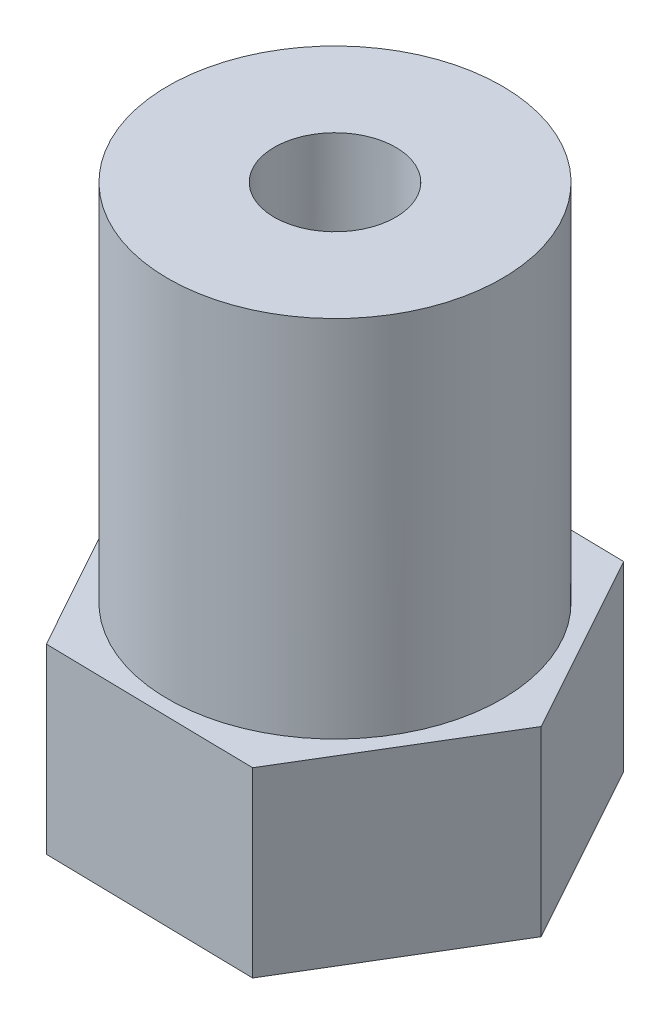
ISO-10303-21;
HEADER;
FILE_DESCRIPTION(('STEP AP214'),'2;1');
FILE_NAME('part.step','',(''),(''),'','','');
FILE_SCHEMA(('AUTOMOTIVE_DESIGN { 1 0 10303 214 1 1 1 1 }'));
ENDSEC;
DATA;
#1=APPLICATION_CONTEXT('core data for automotive mechanical design processes');
#2=APPLICATION_PROTOCOL_DEFINITION('international standard','automotive_design',2000,#1);
#3=PRODUCT_CONTEXT('',#1,'mechanical');
#4=PRODUCT('Part','Part','',(#3));
#5=PRODUCT_RELATED_PRODUCT_CATEGORY('part','',(#4));
#6=PRODUCT_DEFINITION_FORMATION('','',#4);
#7=PRODUCT_DEFINITION_CONTEXT('part definition',#1,'design');
#8=PRODUCT_DEFINITION('design','',#6,#7);
#9=PRODUCT_DEFINITION_SHAPE('','',#8);
#10=(LENGTH_UNIT() NAMED_UNIT(*) SI_UNIT(.MILLI.,.METRE.));
#11=(NAMED_UNIT(*) PLANE_ANGLE_UNIT() SI_UNIT($,.RADIAN.));
#12=(NAMED_UNIT(*) SI_UNIT($,.STERADIAN.) SOLID_ANGLE_UNIT());
#13=UNCERTAINTY_MEASURE_WITH_UNIT(LENGTH_MEASURE(1.E-05),#10,'distance_accuracy_value','');
#14=(GEOMETRIC_REPRESENTATION_CONTEXT(3) GLOBAL_UNCERTAINTY_ASSIGNED_CONTEXT((#13)) GLOBAL_UNIT_ASSIGNED_CONTEXT((#10,
#11,#12)) REPRESENTATION_CONTEXT('',''));
#15=CARTESIAN_POINT('',(0.,0.,0.));
#16=DIRECTION('',(0.,0.,1.));
#17=DIRECTION('',(1.,0.,0.));
#18=AXIS2_PLACEMENT_3D('',#15,#16,#17);
#19=CARTESIAN_POINT('',(0.,12.,0.));
#20=DIRECTION('',(0.,-1.,0.));
#21=DIRECTION('',(0.,0.,-1.));
#22=AXIS2_PLACEMENT_3D('',#19,#20,#21);
#23=CYLINDRICAL_SURFACE('',#22,5.5);
#24=CARTESIAN_POINT('',(0.,7.99724347918509,-5.5));
#25=CARTESIAN_POINT('',(-0.109190966844575,7.99150798310246,-5.50000160584769));
#26=CARTESIAN_POINT('',(-0.217893355600704,7.97679236645259,-5.49671935829978));
#27=CARTESIAN_POINT('',(-0.431116680932088,7.93000165054152,-5.48411785814425));
#28=CARTESIAN_POINT('',(-0.535637488522262,7.89792601623579,-5.4747984194656));
#29=CARTESIAN_POINT('',(-0.737419688843674,7.81766204607608,-5.45128621373905));
#30=CARTESIAN_POINT('',(-0.834695713776041,7.76950732727135,-5.43710361260609));
#31=CARTESIAN_POINT('',(-1.01989505112939,7.65854080306178,-5.40542806137451));
#32=CARTESIAN_POINT('',(-1.10781610424806,7.59572546864283,-5.38793431442899));
#33=CARTESIAN_POINT('',(-1.2755211298687,7.45436112730188,-5.35076741174238));
#34=CARTESIAN_POINT('',(-1.35485833984816,7.3752971749169,-5.33103610320501));
#35=CARTESIAN_POINT('',(-1.49939864460353,7.20499402000117,-5.29220337788619));
#36=CARTESIAN_POINT('',(-1.56459869713977,7.11375220367128,-5.27310209743171));
#37=CARTESIAN_POINT('',(-1.68045668943114,6.9188753167856,-5.2373507129052));
#38=CARTESIAN_POINT('',(-1.73072254035142,6.81499287070177,-5.22077149265896));
#39=CARTESIAN_POINT('',(-1.81272742841725,6.59950021464378,-5.19287159417589));
#40=CARTESIAN_POINT('',(-1.84447536354218,6.48789374500076,-5.18154839092357));
#41=CARTESIAN_POINT('',(-1.88702886561226,6.26601680336966,-5.16619904657778));
#42=CARTESIAN_POINT('',(-1.89879324841239,6.15595364088142,-5.16183945980972));
#43=CARTESIAN_POINT('',(-1.90386241787796,5.9353597266681,-5.15997287528903));
#44=CARTESIAN_POINT('',(-1.89717217694077,5.82482910890629,-5.16246403167772));
#45=CARTESIAN_POINT('',(-1.86639309290652,5.61191505368766,-5.17366573611602));
#46=CARTESIAN_POINT('',(-1.84313873068264,5.50939310700469,-5.18207776533949));
#47=CARTESIAN_POINT('',(-1.7810262979067,5.30973990956169,-5.20375045675684));
#48=CARTESIAN_POINT('',(-1.74216534168879,5.21260965951114,-5.21701201559021));
#49=CARTESIAN_POINT('',(-1.64859354096766,5.02303702618544,-5.24734443348433));
#50=CARTESIAN_POINT('',(-1.59341805886909,4.93084186508697,-5.26452299747749));
#51=CARTESIAN_POINT('',(-1.46926374742691,4.75661248194948,-5.30051274069235));
#52=CARTESIAN_POINT('',(-1.40028015602499,4.67458178121435,-5.31932448188351));
#53=CARTESIAN_POINT('',(-1.24556571380045,4.51784786357802,-5.35773129547569));
#54=CARTESIAN_POINT('',(-1.15907434432745,4.44388781531108,-5.3773049380856));
#55=CARTESIAN_POINT('',(-0.974493649003457,4.31135199235108,-5.41379730484188));
#56=CARTESIAN_POINT('',(-0.876403994929309,4.25277665318547,-5.43071595382229));
#57=CARTESIAN_POINT('',(-0.671135661757936,4.15283928932914,-5.45988187231249));
#58=CARTESIAN_POINT('',(-0.563956857273626,4.11147750215014,-5.47212907736574));
#59=CARTESIAN_POINT('',(-0.34363533237762,4.04754671085956,-5.49036500207096));
#60=CARTESIAN_POINT('',(-0.230495248568585,4.02496947153632,-5.4963564645564));
#61=CARTESIAN_POINT('',(-0.00810853423754321,4.00024346278213,-5.50105714039425));
#62=CARTESIAN_POINT('',(0.101014571705661,3.99704911877602,-5.50014517565157));
#63=CARTESIAN_POINT('',(0.318071283867492,4.00842646414501,-5.49186860922983));
#64=CARTESIAN_POINT('',(0.426005046007963,4.02299579607254,-5.48450486381401));
#65=CARTESIAN_POINT('',(0.634811144340206,4.06872114270568,-5.46422454137458));
#66=CARTESIAN_POINT('',(0.735793383479817,4.0994444947163,-5.4514544280272));
#67=CARTESIAN_POINT('',(0.931077079302978,4.17615440090855,-5.42151861824353));
#68=CARTESIAN_POINT('',(1.02537738234463,4.22214358299485,-5.40435216512478));
#69=CARTESIAN_POINT('',(1.20858035294065,4.33006274522379,-5.36641593564352));
#70=CARTESIAN_POINT('',(1.29714143671514,4.39253236835057,-5.34553396576041));
#71=CARTESIAN_POINT('',(1.4628227336972,4.53083935921857,-5.30259252614518));
#72=CARTESIAN_POINT('',(1.53993871696271,4.60668164675466,-5.28053262514249));
#73=CARTESIAN_POINT('',(1.68460418176125,4.77414907251241,-5.23623198239561));
#74=CARTESIAN_POINT('',(1.75146939128015,4.86637992589956,-5.21403889798202));
#75=CARTESIAN_POINT('',(1.86884367240785,5.06143719070975,-5.17313267653723));
#76=CARTESIAN_POINT('',(1.91935409085,5.16426272873017,-5.15441925300656));
#77=CARTESIAN_POINT('',(2.00185491607258,5.37654941350467,-5.12294032290754));
#78=CARTESIAN_POINT('',(2.03405808919079,5.48591728128704,-5.11010683516272));
#79=CARTESIAN_POINT('',(2.07955827141277,5.70909261370617,-5.09176360208364));
#80=CARTESIAN_POINT('',(2.09286565460489,5.82289760699917,-5.08624983821318));
#81=CARTESIAN_POINT('',(2.09978021859479,6.0440185914472,-5.0833972447307));
#82=CARTESIAN_POINT('',(2.09457293985725,6.15129289503373,-5.0855664219013));
#83=CARTESIAN_POINT('',(2.06727809348776,6.36329899964598,-5.09672192483967));
#84=CARTESIAN_POINT('',(2.04519039096292,6.46803078034728,-5.10570830508428));
#85=CARTESIAN_POINT('',(1.98534992127557,6.67076230639826,-5.12926826101045));
#86=CARTESIAN_POINT('',(1.94779850042591,6.76883036411045,-5.14376984654451));
#87=CARTESIAN_POINT('',(1.85821828030918,6.95737680083179,-5.17680359987132));
#88=CARTESIAN_POINT('',(1.80618548838775,7.0478530777469,-5.19533687893287));
#89=CARTESIAN_POINT('',(1.685588827051,7.22423581867456,-5.23574760970482));
#90=CARTESIAN_POINT('',(1.61624623308484,7.30958006739797,-5.25775610109764));
#91=CARTESIAN_POINT('',(1.46451154860558,7.46770530478162,-5.30202284957464));
#92=CARTESIAN_POINT('',(1.3821158107682,7.54048277010262,-5.3242811748477));
#93=CARTESIAN_POINT('',(1.20260617047635,7.674281361462,-5.3677356610479));
#94=CARTESIAN_POINT('',(1.10503738606482,7.73472012566733,-5.38885442261529));
#95=CARTESIAN_POINT('',(0.900272651048068,7.83813705955573,-5.42681622985336));
#96=CARTESIAN_POINT('',(0.793078496799454,7.88111847901976,-5.44366007110483));
#97=CARTESIAN_POINT('',(0.572865314821434,7.94778053434924,-5.47120127604796));
#98=CARTESIAN_POINT('',(0.459890291623495,7.97158898375923,-5.48193920026538));
#99=CARTESIAN_POINT('',(0.231094730488274,7.99934488863009,-5.4963366074696));
#100=CARTESIAN_POINT('',(0.115275094148808,8.00329855745779,-5.49999830467439));
#101=CARTESIAN_POINT('',(0.,7.99724347918509,-5.5));
#102=B_SPLINE_CURVE_WITH_KNOTS('',3,(#24,#25,#26,#27,#28,#29,#30,#31,#32,#33,#34,#35,#36,#37,
#38,#39,#40,#41,#42,#43,#44,#45,#46,#47,#48,#49,#50,#51,#52,#53,#54,#55,#56,#57,#58,#59,#60,#61,
#62,#63,#64,#65,#66,#67,#68,#69,#70,#71,#72,#73,#74,#75,#76,#77,#78,#79,#80,#81,#82,#83,#84,#85,
#86,#87,#88,#89,#90,#91,#92,#93,#94,#95,#96,#97,#98,#99,#100,#101),.UNSPECIFIED.,.T.,.F.,(4,2,2,
2,2,2,2,2,2,2,2,2,2,2,2,2,2,2,2,2,2,2,2,2,2,2,2,2,2,2,2,2,2,2,2,2,2,2,4),(0.,0.327592312416141,
0.655194721968311,0.982116447312897,1.30911694857544,1.64877628672018,1.9885086453306,
2.33650063412161,2.68432527244747,3.01493339221371,3.3454524419245,3.66040101923202,
3.97540785749622,4.30042976824388,4.62556396433741,4.97036129687487,5.31516838926671,
5.65998023913196,6.00464084250123,6.33053119585901,6.6563783044622,6.97391201397508,
7.29150041304129,7.62116485384509,7.95095083201804,8.29747638758136,8.64397339915796,
8.98635647975295,9.32855151383115,9.64924056686143,9.96993218257169,10.2865739932551,
10.6033031917872,10.9382509568143,11.273292478941,11.6216529406097,11.9699485233026,
12.3159025690767,12.6617483450368),.UNSPECIFIED.);
#103=CARTESIAN_POINT('',(0.,7.99724347918509,-5.5));
#104=VERTEX_POINT('',#103);
#105=EDGE_CURVE('E165',#104,#104,#102,.T.);
#106=ORIENTED_EDGE('',*,*,#105,.T.);
#107=EDGE_LOOP('',(#106));
#108=FACE_BOUND('',#107,.T.);
#109=CARTESIAN_POINT('',(0.,12.,0.));
#110=DIRECTION('',(0.,1.,0.));
#111=DIRECTION('',(0.,0.,1.));
#112=AXIS2_PLACEMENT_3D('',#109,#110,#111);
#113=CIRCLE('',#112,5.5);
#114=CARTESIAN_POINT('',(0.,12.,5.5));
#115=VERTEX_POINT('',#114);
#116=EDGE_CURVE('E154',#115,#115,#113,.T.);
#117=ORIENTED_EDGE('',*,*,#116,.F.);
#118=EDGE_LOOP('',(#117));
#119=FACE_BOUND('',#118,.T.);
#120=CARTESIAN_POINT('',(0.,0.,0.));
#121=DIRECTION('',(0.,-1.,0.));
#122=DIRECTION('',(0.,0.,-1.));
#123=AXIS2_PLACEMENT_3D('',#120,#121,#122);
#124=CIRCLE('',#123,5.5);
#125=CARTESIAN_POINT('',(0.,0.,-5.5));
#126=VERTEX_POINT('',#125);
#127=EDGE_CURVE('E148',#126,#126,#124,.T.);
#128=ORIENTED_EDGE('',*,*,#127,.F.);
#129=EDGE_LOOP('',(#128));
#130=FACE_BOUND('',#129,.T.);
#131=ADVANCED_FACE('F34',(#108,#119,#130),#23,.T.);
#132=CARTESIAN_POINT('',(0.,12.,0.));
#133=DIRECTION('',(0.,1.,0.));
#134=DIRECTION('',(0.,0.,1.));
#135=AXIS2_PLACEMENT_3D('',#132,#133,#134);
#136=PLANE('',#135);
#137=CARTESIAN_POINT('',(0.,12.,0.));
#138=DIRECTION('',(0.,1.,0.));
#139=DIRECTION('',(0.,0.,1.));
#140=AXIS2_PLACEMENT_3D('',#137,#138,#139);
#141=CIRCLE('',#140,2.);
#142=CARTESIAN_POINT('',(0.,12.,2.));
#143=VERTEX_POINT('',#142);
#144=EDGE_CURVE('E151',#143,#143,#141,.T.);
#145=ORIENTED_EDGE('',*,*,#144,.F.);
#146=EDGE_LOOP('',(#145));
#147=FACE_BOUND('',#146,.T.);
#148=ORIENTED_EDGE('',*,*,#116,.T.);
#149=EDGE_LOOP('',(#148));
#150=FACE_BOUND('',#149,.T.);
#151=ADVANCED_FACE('F201',(#147,#150),#136,.T.);
#152=CARTESIAN_POINT('',(0.,0.,0.));
#153=DIRECTION('',(0.,1.,0.));
#154=DIRECTION('',(0.,0.,1.));
#155=AXIS2_PLACEMENT_3D('',#152,#153,#154);
#156=CYLINDRICAL_SURFACE('',#155,2.);
#157=CARTESIAN_POINT('',(0.,6.,0.));
#158=DIRECTION('',(-0.0134953220255268,0.707106781186547,0.706977988542378));
#159=DIRECTION('',(0.0134953220255268,0.707106781186547,-0.706977988542378));
#160=AXIS2_PLACEMENT_3D('',#157,#158,#159);
#161=ELLIPSE('',#160,2.82842712474619,2.);
#162=CARTESIAN_POINT('',(-1.99963571939176,6.,-0.0381705348741882));
#163=VERTEX_POINT('',#162);
#164=CARTESIAN_POINT('',(1.99963571939176,6.,0.0381705348741812));
#165=VERTEX_POINT('',#164);
#166=EDGE_CURVE('E42',#163,#165,#161,.F.);
#167=ORIENTED_EDGE('',*,*,#166,.T.);
#168=CARTESIAN_POINT('',(0.,6.,0.));
#169=DIRECTION('',(0.0134953220255268,0.707106781186547,-0.706977988542378));
#170=DIRECTION('',(-0.0134953220255268,0.707106781186547,0.706977988542378));
#171=AXIS2_PLACEMENT_3D('',#168,#169,#170);
#172=ELLIPSE('',#171,2.82842712474619,2.);
#173=EDGE_CURVE('E11',#165,#163,#172,.T.);
#174=ORIENTED_EDGE('',*,*,#173,.T.);
#175=EDGE_LOOP('',(#167,#174));
#176=FACE_BOUND('',#175,.T.);
#177=ORIENTED_EDGE('',*,*,#144,.T.);
#178=EDGE_LOOP('',(#177));
#179=FACE_BOUND('',#178,.T.);
#180=CARTESIAN_POINT('',(0.,-6.,0.));
#181=DIRECTION('',(0.,-1.,0.));
#182=DIRECTION('',(0.,0.,-1.));
#183=AXIS2_PLACEMENT_3D('',#180,#181,#182);
#184=CIRCLE('',#183,2.);
#185=CARTESIAN_POINT('',(0.,-6.,-2.));
#186=VERTEX_POINT('',#185);
#187=EDGE_CURVE('E131',#186,#186,#184,.T.);
#188=ORIENTED_EDGE('',*,*,#187,.T.);
#189=EDGE_LOOP('',(#188));
#190=FACE_BOUND('',#189,.T.);
#191=ADVANCED_FACE('F157',(#176,#179,#190),#156,.F.);
#192=CARTESIAN_POINT('',(0.,0.,0.));
#193=DIRECTION('',(0.,-1.,0.));
#194=DIRECTION('',(0.,0.,-1.));
#195=AXIS2_PLACEMENT_3D('',#192,#193,#194);
#196=PLANE('',#195);
#197=DIRECTION('',(-0.999817859695882,0.,-0.0190852674370928));
#198=VECTOR('',#197,1.);
#199=CARTESIAN_POINT('',(3.34895905799352,0.,6.06502046392946));
#200=LINE('',#199,#198);
#201=CARTESIAN_POINT('',(3.34895905799352,0.,6.06502046392946));
#202=VERTEX_POINT('',#201);
#203=CARTESIAN_POINT('',(-3.57798226723863,0.,5.93279385242112));
#204=VERTEX_POINT('',#203);
#205=EDGE_CURVE('E127',#202,#204,#200,.T.);
#206=ORIENTED_EDGE('',*,*,#205,.F.);
#207=DIRECTION('',(-0.516437256286483,0.,0.856325031935473));
#208=VECTOR('',#207,1.);
#209=CARTESIAN_POINT('',(6.92694132523216,0.,0.132226611508333));
#210=LINE('',#209,#208);
#211=CARTESIAN_POINT('',(6.92694132523216,0.,0.132226611508333));
#212=VERTEX_POINT('',#211);
#213=EDGE_CURVE('E82',#212,#202,#210,.T.);
#214=ORIENTED_EDGE('',*,*,#213,.F.);
#215=DIRECTION('',(0.483380603409399,0.,0.875410299372566));
#216=VECTOR('',#215,1.);
#217=CARTESIAN_POINT('',(3.57798226723863,0.,-5.93279385242113));
#218=LINE('',#217,#216);
#219=CARTESIAN_POINT('',(3.57798226723863,0.,-5.93279385242113));
#220=VERTEX_POINT('',#219);
#221=EDGE_CURVE('E136',#220,#212,#218,.T.);
#222=ORIENTED_EDGE('',*,*,#221,.F.);
#223=DIRECTION('',(0.999817859695882,0.,0.0190852674370924));
#224=VECTOR('',#223,1.);
#225=CARTESIAN_POINT('',(-3.34895905799353,0.,-6.06502046392946));
#226=LINE('',#225,#224);
#227=CARTESIAN_POINT('',(-3.34895905799353,0.,-6.06502046392946));
#228=VERTEX_POINT('',#227);
#229=EDGE_CURVE('E115',#228,#220,#226,.T.);
#230=ORIENTED_EDGE('',*,*,#229,.F.);
#231=DIRECTION('',(0.516437256286483,0.,-0.856325031935473));
#232=VECTOR('',#231,1.);
#233=CARTESIAN_POINT('',(-6.92694132523216,0.,-0.13222661150834));
#234=LINE('',#233,#232);
#235=CARTESIAN_POINT('',(-6.92694132523216,0.,-0.13222661150834));
#236=VERTEX_POINT('',#235);
#237=EDGE_CURVE('E133',#236,#228,#234,.T.);
#238=ORIENTED_EDGE('',*,*,#237,.F.);
#239=DIRECTION('',(-0.483380603409399,0.,-0.875410299372566));
#240=VECTOR('',#239,1.);
#241=CARTESIAN_POINT('',(-3.57798226723863,0.,5.93279385242112));
#242=LINE('',#241,#240);
#243=EDGE_CURVE('E130',#204,#236,#242,.T.);
#244=ORIENTED_EDGE('',*,*,#243,.F.);
#245=EDGE_LOOP('',(#206,#214,#222,#230,#238,#244));
#246=FACE_BOUND('',#245,.T.);
#247=ORIENTED_EDGE('',*,*,#127,.T.);
#248=EDGE_LOOP('',(#247));
#249=FACE_BOUND('',#248,.T.);
#250=ADVANCED_FACE('F179',(#246,#249),#196,.F.);
#251=CARTESIAN_POINT('',(3.34895905799352,-6.,6.06502046392946));
#252=DIRECTION('',(0.0190852674370927,0.,-0.999817859695882));
#253=DIRECTION('',(-0.999817859695882,0.,-0.0190852674370928));
#254=AXIS2_PLACEMENT_3D('',#251,#252,#253);
#255=PLANE('',#254);
#256=ORIENTED_EDGE('',*,*,#205,.T.);
#257=DIRECTION('',(0.,1.,0.));
#258=VECTOR('',#257,1.);
#259=CARTESIAN_POINT('',(-3.57798226723863,-6.,5.93279385242112));
#260=LINE('',#259,#258);
#261=CARTESIAN_POINT('',(-3.57798226723863,-6.,5.93279385242112));
#262=VERTEX_POINT('',#261);
#263=EDGE_CURVE('E146',#262,#204,#260,.T.);
#264=ORIENTED_EDGE('',*,*,#263,.F.);
#265=DIRECTION('',(-0.999817859695882,0.,-0.0190852674370928));
#266=VECTOR('',#265,1.);
#267=CARTESIAN_POINT('',(3.34895905799352,-6.,6.06502046392946));
#268=LINE('',#267,#266);
#269=CARTESIAN_POINT('',(3.34895905799352,-6.,6.06502046392946));
#270=VERTEX_POINT('',#269);
#271=EDGE_CURVE('E139',#270,#262,#268,.T.);
#272=ORIENTED_EDGE('',*,*,#271,.F.);
#273=DIRECTION('',(0.,1.,0.));
#274=VECTOR('',#273,1.);
#275=CARTESIAN_POINT('',(3.34895905799352,-6.,6.06502046392946));
#276=LINE('',#275,#274);
#277=EDGE_CURVE('E123',#270,#202,#276,.T.);
#278=ORIENTED_EDGE('',*,*,#277,.T.);
#279=EDGE_LOOP('',(#256,#264,#272,#278));
#280=FACE_BOUND('',#279,.T.);
#281=ADVANCED_FACE('F182',(#280),#255,.F.);
#282=CARTESIAN_POINT('',(-3.57798226723863,-6.,5.93279385242112));
#283=DIRECTION('',(0.875410299372566,0.,-0.483380603409399));
#284=DIRECTION('',(-0.483380603409399,0.,-0.875410299372566));
#285=AXIS2_PLACEMENT_3D('',#282,#283,#284);
#286=PLANE('',#285);
#287=ORIENTED_EDGE('',*,*,#243,.T.);
#288=DIRECTION('',(0.,1.,0.));
#289=VECTOR('',#288,1.);
#290=CARTESIAN_POINT('',(-6.92694132523216,-6.,-0.13222661150834));
#291=LINE('',#290,#289);
#292=CARTESIAN_POINT('',(-6.92694132523216,-6.,-0.13222661150834));
#293=VERTEX_POINT('',#292);
#294=EDGE_CURVE('E143',#293,#236,#291,.T.);
#295=ORIENTED_EDGE('',*,*,#294,.F.);
#296=DIRECTION('',(-0.483380603409399,0.,-0.875410299372566));
#297=VECTOR('',#296,1.);
#298=CARTESIAN_POINT('',(-3.57798226723863,-6.,5.93279385242112));
#299=LINE('',#298,#297);
#300=EDGE_CURVE('E91',#262,#293,#299,.T.);
#301=ORIENTED_EDGE('',*,*,#300,.F.);
#302=ORIENTED_EDGE('',*,*,#263,.T.);
#303=EDGE_LOOP('',(#287,#295,#301,#302));
#304=FACE_BOUND('',#303,.T.);
#305=ADVANCED_FACE('F193',(#304),#286,.F.);
#306=CARTESIAN_POINT('',(-6.92694132523216,-6.,-0.13222661150834));
#307=DIRECTION('',(0.856325031935473,0.,0.516437256286483));
#308=DIRECTION('',(0.516437256286483,0.,-0.856325031935473));
#309=AXIS2_PLACEMENT_3D('',#306,#307,#308);
#310=PLANE('',#309);
#311=ORIENTED_EDGE('',*,*,#237,.T.);
#312=DIRECTION('',(0.,1.,0.));
#313=VECTOR('',#312,1.);
#314=CARTESIAN_POINT('',(-3.34895905799353,-6.,-6.06502046392946));
#315=LINE('',#314,#313);
#316=CARTESIAN_POINT('',(-3.34895905799353,-6.,-6.06502046392946));
#317=VERTEX_POINT('',#316);
#318=EDGE_CURVE('E118',#317,#228,#315,.T.);
#319=ORIENTED_EDGE('',*,*,#318,.F.);
#320=DIRECTION('',(0.516437256286483,0.,-0.856325031935473));
#321=VECTOR('',#320,1.);
#322=CARTESIAN_POINT('',(-6.92694132523216,-6.,-0.13222661150834));
#323=LINE('',#322,#321);
#324=EDGE_CURVE('E106',#293,#317,#323,.T.);
#325=ORIENTED_EDGE('',*,*,#324,.F.);
#326=ORIENTED_EDGE('',*,*,#294,.T.);
#327=EDGE_LOOP('',(#311,#319,#325,#326));
#328=FACE_BOUND('',#327,.T.);
#329=ADVANCED_FACE('F190',(#328),#310,.F.);
#330=CARTESIAN_POINT('',(-3.34895905799353,-6.,-6.06502046392946));
#331=DIRECTION('',(-0.0190852674370924,0.,0.999817859695882));
#332=DIRECTION('',(0.999817859695882,0.,0.0190852674370924));
#333=AXIS2_PLACEMENT_3D('',#330,#331,#332);
#334=PLANE('',#333);
#335=ORIENTED_EDGE('',*,*,#229,.T.);
#336=DIRECTION('',(0.,1.,0.));
#337=VECTOR('',#336,1.);
#338=CARTESIAN_POINT('',(3.57798226723863,-6.,-5.93279385242113));
#339=LINE('',#338,#337);
#340=CARTESIAN_POINT('',(3.57798226723863,-6.,-5.93279385242113));
#341=VERTEX_POINT('',#340);
#342=EDGE_CURVE('E112',#341,#220,#339,.T.);
#343=ORIENTED_EDGE('',*,*,#342,.F.);
#344=DIRECTION('',(0.999817859695882,0.,0.0190852674370924));
#345=VECTOR('',#344,1.);
#346=CARTESIAN_POINT('',(-3.34895905799353,-6.,-6.06502046392946));
#347=LINE('',#346,#345);
#348=EDGE_CURVE('E99',#317,#341,#347,.T.);
#349=ORIENTED_EDGE('',*,*,#348,.F.);
#350=ORIENTED_EDGE('',*,*,#318,.T.);
#351=EDGE_LOOP('',(#335,#343,#349,#350));
#352=FACE_BOUND('',#351,.T.);
#353=ADVANCED_FACE('F113',(#352),#334,.F.);
#354=CARTESIAN_POINT('',(3.57798226723863,-6.,-5.93279385242113));
#355=DIRECTION('',(-0.875410299372566,0.,0.483380603409399));
#356=DIRECTION('',(0.483380603409399,0.,0.875410299372566));
#357=AXIS2_PLACEMENT_3D('',#354,#355,#356);
#358=PLANE('',#357);
#359=ORIENTED_EDGE('',*,*,#221,.T.);
#360=DIRECTION('',(0.,1.,0.));
#361=VECTOR('',#360,1.);
#362=CARTESIAN_POINT('',(6.92694132523216,-6.,0.132226611508333));
#363=LINE('',#362,#361);
#364=CARTESIAN_POINT('',(6.92694132523216,-6.,0.132226611508333));
#365=VERTEX_POINT('',#364);
#366=EDGE_CURVE('E119',#365,#212,#363,.T.);
#367=ORIENTED_EDGE('',*,*,#366,.F.);
#368=DIRECTION('',(0.483380603409399,0.,0.875410299372566));
#369=VECTOR('',#368,1.);
#370=CARTESIAN_POINT('',(3.57798226723863,-6.,-5.93279385242113));
#371=LINE('',#370,#369);
#372=EDGE_CURVE('E103',#341,#365,#371,.T.);
#373=ORIENTED_EDGE('',*,*,#372,.F.);
#374=ORIENTED_EDGE('',*,*,#342,.T.);
#375=EDGE_LOOP('',(#359,#367,#373,#374));
#376=FACE_BOUND('',#375,.T.);
#377=ADVANCED_FACE('F121',(#376),#358,.F.);
#378=CARTESIAN_POINT('',(6.92694132523216,-6.,0.132226611508333));
#379=DIRECTION('',(-0.856325031935473,0.,-0.516437256286483));
#380=DIRECTION('',(-0.516437256286483,0.,0.856325031935474));
#381=AXIS2_PLACEMENT_3D('',#378,#379,#380);
#382=PLANE('',#381);
#383=ORIENTED_EDGE('',*,*,#213,.T.);
#384=ORIENTED_EDGE('',*,*,#277,.F.);
#385=DIRECTION('',(-0.516437256286483,0.,0.856325031935473));
#386=VECTOR('',#385,1.);
#387=CARTESIAN_POINT('',(6.92694132523216,-6.,0.132226611508333));
#388=LINE('',#387,#386);
#389=EDGE_CURVE('E55',#365,#270,#388,.T.);
#390=ORIENTED_EDGE('',*,*,#389,.F.);
#391=ORIENTED_EDGE('',*,*,#366,.T.);
#392=EDGE_LOOP('',(#383,#384,#390,#391));
#393=FACE_BOUND('',#392,.T.);
#394=ADVANCED_FACE('F177',(#393),#382,.F.);
#395=CARTESIAN_POINT('',(0.,-6.,0.));
#396=DIRECTION('',(0.,-1.,0.));
#397=DIRECTION('',(0.,0.,-1.));
#398=AXIS2_PLACEMENT_3D('',#395,#396,#397);
#399=PLANE('',#398);
#400=ORIENTED_EDGE('',*,*,#187,.F.);
#401=EDGE_LOOP('',(#400));
#402=FACE_BOUND('',#401,.T.);
#403=ORIENTED_EDGE('',*,*,#271,.T.);
#404=ORIENTED_EDGE('',*,*,#300,.T.);
#405=ORIENTED_EDGE('',*,*,#324,.T.);
#406=ORIENTED_EDGE('',*,*,#348,.T.);
#407=ORIENTED_EDGE('',*,*,#372,.T.);
#408=ORIENTED_EDGE('',*,*,#389,.T.);
#409=EDGE_LOOP('',(#403,#404,#405,#406,#407,#408));
#410=FACE_BOUND('',#409,.T.);
#411=ADVANCED_FACE('F101',(#402,#410),#399,.T.);
#412=CARTESIAN_POINT('',(0.,6.,0.));
#413=DIRECTION('',(0.0190852674370924,0.,-0.999817859695882));
#414=DIRECTION('',(-0.999817859695882,0.,-0.0190852674370924));
#415=AXIS2_PLACEMENT_3D('',#412,#413,#414);
#416=CYLINDRICAL_SURFACE('',#415,2.);
#417=ORIENTED_EDGE('',*,*,#166,.F.);
#418=ORIENTED_EDGE('',*,*,#173,.F.);
#419=EDGE_LOOP('',(#417,#418));
#420=FACE_BOUND('',#419,.T.);
#421=ORIENTED_EDGE('',*,*,#105,.F.);
#422=EDGE_LOOP('',(#421));
#423=FACE_BOUND('',#422,.T.);
#424=ADVANCED_FACE('F159',(#420,#423),#416,.F.);
#425=CLOSED_SHELL('',(#131,#151,#191,#250,#281,#305,#329,#353,#377,#394,#411,#424));
#426=MANIFOLD_SOLID_BREP('B2',#425);
#427=ADVANCED_BREP_SHAPE_REPRESENTATION('',(#18,#426),#14);
#428=SHAPE_DEFINITION_REPRESENTATION(#9,#427);
ENDSEC;
END-ISO-10303-21;
